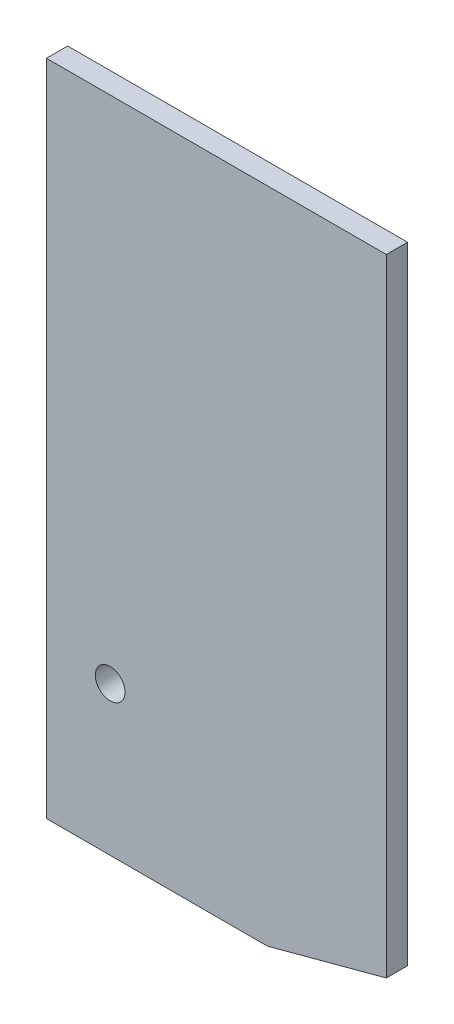
ISO-10303-21;
HEADER;
FILE_DESCRIPTION(('STEP AP214'),'2;1');
FILE_NAME('part.step','',(''),(''),'','','');
FILE_SCHEMA(('AUTOMOTIVE_DESIGN { 1 0 10303 214 1 1 1 1 }'));
ENDSEC;
DATA;
#1=APPLICATION_CONTEXT('core data for automotive mechanical design processes');
#2=APPLICATION_PROTOCOL_DEFINITION('international standard','automotive_design',2000,#1);
#3=PRODUCT_CONTEXT('',#1,'mechanical');
#4=PRODUCT('Part','Part','',(#3));
#5=PRODUCT_RELATED_PRODUCT_CATEGORY('part','',(#4));
#6=PRODUCT_DEFINITION_FORMATION('','',#4);
#7=PRODUCT_DEFINITION_CONTEXT('part definition',#1,'design');
#8=PRODUCT_DEFINITION('design','',#6,#7);
#9=PRODUCT_DEFINITION_SHAPE('','',#8);
#10=(LENGTH_UNIT() NAMED_UNIT(*) SI_UNIT(.MILLI.,.METRE.));
#11=(NAMED_UNIT(*) PLANE_ANGLE_UNIT() SI_UNIT($,.RADIAN.));
#12=(NAMED_UNIT(*) SI_UNIT($,.STERADIAN.) SOLID_ANGLE_UNIT());
#13=UNCERTAINTY_MEASURE_WITH_UNIT(LENGTH_MEASURE(1.E-05),#10,'distance_accuracy_value','');
#14=(GEOMETRIC_REPRESENTATION_CONTEXT(3) GLOBAL_UNCERTAINTY_ASSIGNED_CONTEXT((#13)) GLOBAL_UNIT_ASSIGNED_CONTEXT((#10,
#11,#12)) REPRESENTATION_CONTEXT('',''));
#15=CARTESIAN_POINT('',(0.,0.,0.));
#16=DIRECTION('',(0.,0.,1.));
#17=DIRECTION('',(1.,0.,0.));
#18=AXIS2_PLACEMENT_3D('',#15,#16,#17);
#19=CARTESIAN_POINT('',(0.,0.,5.));
#20=DIRECTION('',(0.,0.,-1.));
#21=DIRECTION('',(-1.,0.,0.));
#22=AXIS2_PLACEMENT_3D('',#19,#20,#21);
#23=PLANE('',#22);
#24=DIRECTION('',(0.,-1.,0.));
#25=VECTOR('',#24,1.);
#26=CARTESIAN_POINT('',(0.,0.,5.));
#27=LINE('',#26,#25);
#28=CARTESIAN_POINT('',(0.,155.,5.));
#29=VERTEX_POINT('',#28);
#30=CARTESIAN_POINT('',(0.,0.,5.));
#31=VERTEX_POINT('',#30);
#32=EDGE_CURVE('E117',#29,#31,#27,.T.);
#33=ORIENTED_EDGE('',*,*,#32,.T.);
#34=DIRECTION('',(1.,0.,0.));
#35=VECTOR('',#34,1.);
#36=CARTESIAN_POINT('',(0.,0.,5.));
#37=LINE('',#36,#35);
#38=CARTESIAN_POINT('',(52.0096189432344,0.,5.));
#39=VERTEX_POINT('',#38);
#40=EDGE_CURVE('E84',#31,#39,#37,.T.);
#41=ORIENTED_EDGE('',*,*,#40,.T.);
#42=DIRECTION('',(0.965925826289066,0.258819045102528,0.));
#43=VECTOR('',#42,1.);
#44=CARTESIAN_POINT('',(52.0096189432344,0.,5.));
#45=LINE('',#44,#43);
#46=CARTESIAN_POINT('',(80.,7.49999999999998,5.));
#47=VERTEX_POINT('',#46);
#48=EDGE_CURVE('E88',#39,#47,#45,.T.);
#49=ORIENTED_EDGE('',*,*,#48,.T.);
#50=DIRECTION('',(0.,1.,0.));
#51=VECTOR('',#50,1.);
#52=CARTESIAN_POINT('',(80.,7.49999999999998,5.));
#53=LINE('',#52,#51);
#54=CARTESIAN_POINT('',(80.,155.,5.));
#55=VERTEX_POINT('',#54);
#56=EDGE_CURVE('E92',#47,#55,#53,.T.);
#57=ORIENTED_EDGE('',*,*,#56,.T.);
#58=DIRECTION('',(-1.,0.,0.));
#59=VECTOR('',#58,1.);
#60=CARTESIAN_POINT('',(0.,155.,5.));
#61=LINE('',#60,#59);
#62=EDGE_CURVE('E50',#55,#29,#61,.T.);
#63=ORIENTED_EDGE('',*,*,#62,.T.);
#64=EDGE_LOOP('',(#33,#41,#49,#57,#63));
#65=FACE_BOUND('',#64,.T.);
#66=CARTESIAN_POINT('',(15.,35.,5.));
#67=DIRECTION('',(0.,0.,1.));
#68=DIRECTION('',(1.,0.,0.));
#69=AXIS2_PLACEMENT_3D('',#66,#67,#68);
#70=CIRCLE('',#69,3.5);
#71=CARTESIAN_POINT('',(18.5,35.,5.));
#72=VERTEX_POINT('',#71);
#73=EDGE_CURVE('E112',#72,#72,#70,.T.);
#74=ORIENTED_EDGE('',*,*,#73,.F.);
#75=EDGE_LOOP('',(#74));
#76=FACE_BOUND('',#75,.T.);
#77=ADVANCED_FACE('F33',(#65,#76),#23,.F.);
#78=CARTESIAN_POINT('',(0.,0.,0.));
#79=DIRECTION('',(0.,0.,-1.));
#80=DIRECTION('',(-1.,0.,0.));
#81=AXIS2_PLACEMENT_3D('',#78,#79,#80);
#82=PLANE('',#81);
#83=DIRECTION('',(0.,-1.,0.));
#84=VECTOR('',#83,1.);
#85=CARTESIAN_POINT('',(0.,0.,0.));
#86=LINE('',#85,#84);
#87=CARTESIAN_POINT('',(0.,155.,0.));
#88=VERTEX_POINT('',#87);
#89=CARTESIAN_POINT('',(0.,0.,0.));
#90=VERTEX_POINT('',#89);
#91=EDGE_CURVE('E108',#88,#90,#86,.T.);
#92=ORIENTED_EDGE('',*,*,#91,.F.);
#93=DIRECTION('',(-1.,0.,0.));
#94=VECTOR('',#93,1.);
#95=CARTESIAN_POINT('',(0.,155.,0.));
#96=LINE('',#95,#94);
#97=CARTESIAN_POINT('',(80.,155.,0.));
#98=VERTEX_POINT('',#97);
#99=EDGE_CURVE('E76',#98,#88,#96,.T.);
#100=ORIENTED_EDGE('',*,*,#99,.F.);
#101=DIRECTION('',(0.,1.,0.));
#102=VECTOR('',#101,1.);
#103=CARTESIAN_POINT('',(80.,7.49999999999998,0.));
#104=LINE('',#103,#102);
#105=CARTESIAN_POINT('',(80.,7.49999999999998,0.));
#106=VERTEX_POINT('',#105);
#107=EDGE_CURVE('E70',#106,#98,#104,.T.);
#108=ORIENTED_EDGE('',*,*,#107,.F.);
#109=DIRECTION('',(0.965925826289066,0.258819045102528,0.));
#110=VECTOR('',#109,1.);
#111=CARTESIAN_POINT('',(52.0096189432344,0.,0.));
#112=LINE('',#111,#110);
#113=CARTESIAN_POINT('',(52.0096189432344,0.,0.));
#114=VERTEX_POINT('',#113);
#115=EDGE_CURVE('E99',#114,#106,#112,.T.);
#116=ORIENTED_EDGE('',*,*,#115,.F.);
#117=DIRECTION('',(1.,0.,0.));
#118=VECTOR('',#117,1.);
#119=CARTESIAN_POINT('',(0.,0.,0.));
#120=LINE('',#119,#118);
#121=EDGE_CURVE('E111',#90,#114,#120,.T.);
#122=ORIENTED_EDGE('',*,*,#121,.F.);
#123=EDGE_LOOP('',(#92,#100,#108,#116,#122));
#124=FACE_BOUND('',#123,.T.);
#125=CARTESIAN_POINT('',(15.,35.,0.));
#126=DIRECTION('',(0.,0.,1.));
#127=DIRECTION('',(1.,0.,0.));
#128=AXIS2_PLACEMENT_3D('',#125,#126,#127);
#129=CIRCLE('',#128,3.5);
#130=CARTESIAN_POINT('',(18.5,35.,0.));
#131=VERTEX_POINT('',#130);
#132=EDGE_CURVE('E197',#131,#131,#129,.T.);
#133=ORIENTED_EDGE('',*,*,#132,.T.);
#134=EDGE_LOOP('',(#133));
#135=FACE_BOUND('',#134,.T.);
#136=ADVANCED_FACE('F121',(#124,#135),#82,.T.);
#137=CARTESIAN_POINT('',(0.,0.,5.));
#138=DIRECTION('',(1.,0.,0.));
#139=DIRECTION('',(0.,0.,-1.));
#140=AXIS2_PLACEMENT_3D('',#137,#138,#139);
#141=PLANE('',#140);
#142=ORIENTED_EDGE('',*,*,#91,.T.);
#143=DIRECTION('',(0.,0.,-1.));
#144=VECTOR('',#143,1.);
#145=CARTESIAN_POINT('',(0.,0.,5.));
#146=LINE('',#145,#144);
#147=EDGE_CURVE('E11',#31,#90,#146,.T.);
#148=ORIENTED_EDGE('',*,*,#147,.F.);
#149=ORIENTED_EDGE('',*,*,#32,.F.);
#150=DIRECTION('',(0.,0.,-1.));
#151=VECTOR('',#150,1.);
#152=CARTESIAN_POINT('',(0.,155.,5.));
#153=LINE('',#152,#151);
#154=EDGE_CURVE('E104',#29,#88,#153,.T.);
#155=ORIENTED_EDGE('',*,*,#154,.T.);
#156=EDGE_LOOP('',(#142,#148,#149,#155));
#157=FACE_BOUND('',#156,.T.);
#158=ADVANCED_FACE('F35',(#157),#141,.F.);
#159=CARTESIAN_POINT('',(0.,0.,5.));
#160=DIRECTION('',(0.,1.,0.));
#161=DIRECTION('',(-1.,0.,0.));
#162=AXIS2_PLACEMENT_3D('',#159,#160,#161);
#163=PLANE('',#162);
#164=ORIENTED_EDGE('',*,*,#121,.T.);
#165=DIRECTION('',(0.,0.,-1.));
#166=VECTOR('',#165,1.);
#167=CARTESIAN_POINT('',(52.0096189432344,0.,5.));
#168=LINE('',#167,#166);
#169=EDGE_CURVE('E42',#39,#114,#168,.T.);
#170=ORIENTED_EDGE('',*,*,#169,.F.);
#171=ORIENTED_EDGE('',*,*,#40,.F.);
#172=ORIENTED_EDGE('',*,*,#147,.T.);
#173=EDGE_LOOP('',(#164,#170,#171,#172));
#174=FACE_BOUND('',#173,.T.);
#175=ADVANCED_FACE('F146',(#174),#163,.F.);
#176=CARTESIAN_POINT('',(52.0096189432344,0.,5.));
#177=DIRECTION('',(-0.258819045102528,0.965925826289066,0.));
#178=DIRECTION('',(-0.965925826289066,-0.258819045102528,0.));
#179=AXIS2_PLACEMENT_3D('',#176,#177,#178);
#180=PLANE('',#179);
#181=ORIENTED_EDGE('',*,*,#115,.T.);
#182=DIRECTION('',(0.,0.,-1.));
#183=VECTOR('',#182,1.);
#184=CARTESIAN_POINT('',(80.,7.49999999999998,5.));
#185=LINE('',#184,#183);
#186=EDGE_CURVE('E96',#47,#106,#185,.T.);
#187=ORIENTED_EDGE('',*,*,#186,.F.);
#188=ORIENTED_EDGE('',*,*,#48,.F.);
#189=ORIENTED_EDGE('',*,*,#169,.T.);
#190=EDGE_LOOP('',(#181,#187,#188,#189));
#191=FACE_BOUND('',#190,.T.);
#192=ADVANCED_FACE('F97',(#191),#180,.F.);
#193=CARTESIAN_POINT('',(80.,7.49999999999998,5.));
#194=DIRECTION('',(-1.,0.,0.));
#195=DIRECTION('',(0.,0.,1.));
#196=AXIS2_PLACEMENT_3D('',#193,#194,#195);
#197=PLANE('',#196);
#198=ORIENTED_EDGE('',*,*,#107,.T.);
#199=DIRECTION('',(0.,0.,-1.));
#200=VECTOR('',#199,1.);
#201=CARTESIAN_POINT('',(80.,155.,5.));
#202=LINE('',#201,#200);
#203=EDGE_CURVE('E100',#55,#98,#202,.T.);
#204=ORIENTED_EDGE('',*,*,#203,.F.);
#205=ORIENTED_EDGE('',*,*,#56,.F.);
#206=ORIENTED_EDGE('',*,*,#186,.T.);
#207=EDGE_LOOP('',(#198,#204,#205,#206));
#208=FACE_BOUND('',#207,.T.);
#209=ADVANCED_FACE('F102',(#208),#197,.F.);
#210=CARTESIAN_POINT('',(0.,155.,5.));
#211=DIRECTION('',(0.,-1.,0.));
#212=DIRECTION('',(0.,0.,-1.));
#213=AXIS2_PLACEMENT_3D('',#210,#211,#212);
#214=PLANE('',#213);
#215=ORIENTED_EDGE('',*,*,#99,.T.);
#216=ORIENTED_EDGE('',*,*,#154,.F.);
#217=ORIENTED_EDGE('',*,*,#62,.F.);
#218=ORIENTED_EDGE('',*,*,#203,.T.);
#219=EDGE_LOOP('',(#215,#216,#217,#218));
#220=FACE_BOUND('',#219,.T.);
#221=ADVANCED_FACE('F126',(#220),#214,.F.);
#222=CARTESIAN_POINT('',(15.,35.,5.));
#223=DIRECTION('',(0.,0.,-1.));
#224=DIRECTION('',(-1.,0.,0.));
#225=AXIS2_PLACEMENT_3D('',#222,#223,#224);
#226=CYLINDRICAL_SURFACE('',#225,3.5);
#227=ORIENTED_EDGE('',*,*,#73,.T.);
#228=EDGE_LOOP('',(#227));
#229=FACE_BOUND('',#228,.T.);
#230=ORIENTED_EDGE('',*,*,#132,.F.);
#231=EDGE_LOOP('',(#230));
#232=FACE_BOUND('',#231,.T.);
#233=ADVANCED_FACE('F128',(#229,#232),#226,.F.);
#234=CLOSED_SHELL('',(#77,#136,#158,#175,#192,#209,#221,#233));
#235=MANIFOLD_SOLID_BREP('B2',#234);
#236=ADVANCED_BREP_SHAPE_REPRESENTATION('',(#18,#235),#14);
#237=SHAPE_DEFINITION_REPRESENTATION(#9,#236);
ENDSEC;
END-ISO-10303-21;
